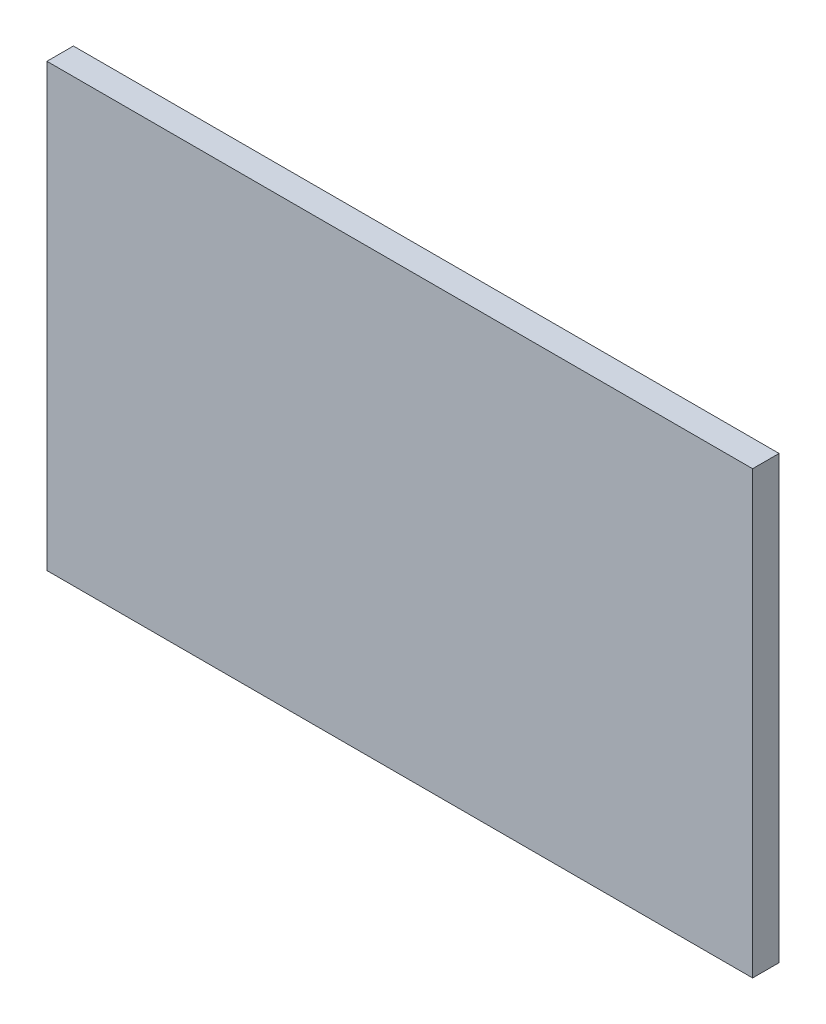
ISO-10303-21;
HEADER;
FILE_DESCRIPTION(('STEP AP214'),'2;1');
FILE_NAME('part.step','',(''),(''),'','','');
FILE_SCHEMA(('AUTOMOTIVE_DESIGN { 1 0 10303 214 1 1 1 1 }'));
ENDSEC;
DATA;
#1=APPLICATION_CONTEXT('core data for automotive mechanical design processes');
#2=APPLICATION_PROTOCOL_DEFINITION('international standard','automotive_design',2000,#1);
#3=PRODUCT_CONTEXT('',#1,'mechanical');
#4=PRODUCT('Part','Part','',(#3));
#5=PRODUCT_RELATED_PRODUCT_CATEGORY('part','',(#4));
#6=PRODUCT_DEFINITION_FORMATION('','',#4);
#7=PRODUCT_DEFINITION_CONTEXT('part definition',#1,'design');
#8=PRODUCT_DEFINITION('design','',#6,#7);
#9=PRODUCT_DEFINITION_SHAPE('','',#8);
#10=(LENGTH_UNIT() NAMED_UNIT(*) SI_UNIT(.MILLI.,.METRE.));
#11=(NAMED_UNIT(*) PLANE_ANGLE_UNIT() SI_UNIT($,.RADIAN.));
#12=(NAMED_UNIT(*) SI_UNIT($,.STERADIAN.) SOLID_ANGLE_UNIT());
#13=UNCERTAINTY_MEASURE_WITH_UNIT(LENGTH_MEASURE(1.E-05),#10,'distance_accuracy_value','');
#14=(GEOMETRIC_REPRESENTATION_CONTEXT(3) GLOBAL_UNCERTAINTY_ASSIGNED_CONTEXT((#13)) GLOBAL_UNIT_ASSIGNED_CONTEXT((#10,
#11,#12)) REPRESENTATION_CONTEXT('',''));
#15=CARTESIAN_POINT('',(0.,0.,0.));
#16=DIRECTION('',(0.,0.,1.));
#17=DIRECTION('',(1.,0.,0.));
#18=AXIS2_PLACEMENT_3D('',#15,#16,#17);
#19=CARTESIAN_POINT('',(-40.,-25.,3.));
#20=DIRECTION('',(1.,0.,0.));
#21=DIRECTION('',(0.,0.,-1.));
#22=AXIS2_PLACEMENT_3D('',#19,#20,#21);
#23=PLANE('',#22);
#24=DIRECTION('',(0.,-1.,0.));
#25=VECTOR('',#24,1.);
#26=CARTESIAN_POINT('',(-40.,-25.,0.));
#27=LINE('',#26,#25);
#28=CARTESIAN_POINT('',(-40.,25.,0.));
#29=VERTEX_POINT('',#28);
#30=CARTESIAN_POINT('',(-40.,-25.,0.));
#31=VERTEX_POINT('',#30);
#32=EDGE_CURVE('E96',#29,#31,#27,.T.);
#33=ORIENTED_EDGE('',*,*,#32,.T.);
#34=DIRECTION('',(0.,0.,-1.));
#35=VECTOR('',#34,1.);
#36=CARTESIAN_POINT('',(-40.,-25.,3.));
#37=LINE('',#36,#35);
#38=CARTESIAN_POINT('',(-40.,-25.,3.));
#39=VERTEX_POINT('',#38);
#40=EDGE_CURVE('E11',#39,#31,#37,.T.);
#41=ORIENTED_EDGE('',*,*,#40,.F.);
#42=DIRECTION('',(0.,-1.,0.));
#43=VECTOR('',#42,1.);
#44=CARTESIAN_POINT('',(-40.,-25.,3.));
#45=LINE('',#44,#43);
#46=CARTESIAN_POINT('',(-40.,25.,3.));
#47=VERTEX_POINT('',#46);
#48=EDGE_CURVE('E84',#47,#39,#45,.T.);
#49=ORIENTED_EDGE('',*,*,#48,.F.);
#50=DIRECTION('',(0.,0.,-1.));
#51=VECTOR('',#50,1.);
#52=CARTESIAN_POINT('',(-40.,25.,3.));
#53=LINE('',#52,#51);
#54=EDGE_CURVE('E92',#47,#29,#53,.T.);
#55=ORIENTED_EDGE('',*,*,#54,.T.);
#56=EDGE_LOOP('',(#33,#41,#49,#55));
#57=FACE_BOUND('',#56,.T.);
#58=ADVANCED_FACE('F33',(#57),#23,.F.);
#59=CARTESIAN_POINT('',(40.,-25.,3.));
#60=DIRECTION('',(0.,1.,0.));
#61=DIRECTION('',(-1.,0.,0.));
#62=AXIS2_PLACEMENT_3D('',#59,#60,#61);
#63=PLANE('',#62);
#64=DIRECTION('',(1.,0.,0.));
#65=VECTOR('',#64,1.);
#66=CARTESIAN_POINT('',(40.,-25.,0.));
#67=LINE('',#66,#65);
#68=CARTESIAN_POINT('',(40.,-25.,0.));
#69=VERTEX_POINT('',#68);
#70=EDGE_CURVE('E88',#31,#69,#67,.T.);
#71=ORIENTED_EDGE('',*,*,#70,.T.);
#72=DIRECTION('',(0.,0.,-1.));
#73=VECTOR('',#72,1.);
#74=CARTESIAN_POINT('',(40.,-25.,3.));
#75=LINE('',#74,#73);
#76=CARTESIAN_POINT('',(40.,-25.,3.));
#77=VERTEX_POINT('',#76);
#78=EDGE_CURVE('E41',#77,#69,#75,.T.);
#79=ORIENTED_EDGE('',*,*,#78,.F.);
#80=DIRECTION('',(1.,0.,0.));
#81=VECTOR('',#80,1.);
#82=CARTESIAN_POINT('',(40.,-25.,3.));
#83=LINE('',#82,#81);
#84=EDGE_CURVE('E79',#39,#77,#83,.T.);
#85=ORIENTED_EDGE('',*,*,#84,.F.);
#86=ORIENTED_EDGE('',*,*,#40,.T.);
#87=EDGE_LOOP('',(#71,#79,#85,#86));
#88=FACE_BOUND('',#87,.T.);
#89=ADVANCED_FACE('F87',(#88),#63,.F.);
#90=CARTESIAN_POINT('',(40.,-25.,3.));
#91=DIRECTION('',(-1.,0.,0.));
#92=DIRECTION('',(0.,0.,1.));
#93=AXIS2_PLACEMENT_3D('',#90,#91,#92);
#94=PLANE('',#93);
#95=DIRECTION('',(0.,1.,0.));
#96=VECTOR('',#95,1.);
#97=CARTESIAN_POINT('',(40.,-25.,0.));
#98=LINE('',#97,#96);
#99=CARTESIAN_POINT('',(40.,25.,0.));
#100=VERTEX_POINT('',#99);
#101=EDGE_CURVE('E66',#69,#100,#98,.T.);
#102=ORIENTED_EDGE('',*,*,#101,.T.);
#103=DIRECTION('',(0.,0.,-1.));
#104=VECTOR('',#103,1.);
#105=CARTESIAN_POINT('',(40.,25.,3.));
#106=LINE('',#105,#104);
#107=CARTESIAN_POINT('',(40.,25.,3.));
#108=VERTEX_POINT('',#107);
#109=EDGE_CURVE('E89',#108,#100,#106,.T.);
#110=ORIENTED_EDGE('',*,*,#109,.F.);
#111=DIRECTION('',(0.,1.,0.));
#112=VECTOR('',#111,1.);
#113=CARTESIAN_POINT('',(40.,-25.,3.));
#114=LINE('',#113,#112);
#115=EDGE_CURVE('E82',#77,#108,#114,.T.);
#116=ORIENTED_EDGE('',*,*,#115,.F.);
#117=ORIENTED_EDGE('',*,*,#78,.T.);
#118=EDGE_LOOP('',(#102,#110,#116,#117));
#119=FACE_BOUND('',#118,.T.);
#120=ADVANCED_FACE('F90',(#119),#94,.F.);
#121=CARTESIAN_POINT('',(40.,25.,3.));
#122=DIRECTION('',(0.,-1.,0.));
#123=DIRECTION('',(1.,0.,0.));
#124=AXIS2_PLACEMENT_3D('',#121,#122,#123);
#125=PLANE('',#124);
#126=DIRECTION('',(-1.,0.,0.));
#127=VECTOR('',#126,1.);
#128=CARTESIAN_POINT('',(40.,25.,0.));
#129=LINE('',#128,#127);
#130=EDGE_CURVE('E72',#100,#29,#129,.T.);
#131=ORIENTED_EDGE('',*,*,#130,.T.);
#132=ORIENTED_EDGE('',*,*,#54,.F.);
#133=DIRECTION('',(-1.,0.,0.));
#134=VECTOR('',#133,1.);
#135=CARTESIAN_POINT('',(40.,25.,3.));
#136=LINE('',#135,#134);
#137=EDGE_CURVE('E49',#108,#47,#136,.T.);
#138=ORIENTED_EDGE('',*,*,#137,.F.);
#139=ORIENTED_EDGE('',*,*,#109,.T.);
#140=EDGE_LOOP('',(#131,#132,#138,#139));
#141=FACE_BOUND('',#140,.T.);
#142=ADVANCED_FACE('F103',(#141),#125,.F.);
#143=CARTESIAN_POINT('',(0.,0.,3.));
#144=DIRECTION('',(0.,0.,1.));
#145=DIRECTION('',(1.,0.,0.));
#146=AXIS2_PLACEMENT_3D('',#143,#144,#145);
#147=PLANE('',#146);
#148=ORIENTED_EDGE('',*,*,#48,.T.);
#149=ORIENTED_EDGE('',*,*,#84,.T.);
#150=ORIENTED_EDGE('',*,*,#115,.T.);
#151=ORIENTED_EDGE('',*,*,#137,.T.);
#152=EDGE_LOOP('',(#148,#149,#150,#151));
#153=FACE_BOUND('',#152,.T.);
#154=ADVANCED_FACE('F80',(#153),#147,.T.);
#155=CARTESIAN_POINT('',(0.,0.,0.));
#156=DIRECTION('',(0.,0.,1.));
#157=DIRECTION('',(1.,0.,0.));
#158=AXIS2_PLACEMENT_3D('',#155,#156,#157);
#159=PLANE('',#158);
#160=ORIENTED_EDGE('',*,*,#32,.F.);
#161=ORIENTED_EDGE('',*,*,#130,.F.);
#162=ORIENTED_EDGE('',*,*,#101,.F.);
#163=ORIENTED_EDGE('',*,*,#70,.F.);
#164=EDGE_LOOP('',(#160,#161,#162,#163));
#165=FACE_BOUND('',#164,.T.);
#166=ADVANCED_FACE('F106',(#165),#159,.F.);
#167=CLOSED_SHELL('',(#58,#89,#120,#142,#154,#166));
#168=MANIFOLD_SOLID_BREP('B2',#167);
#169=ADVANCED_BREP_SHAPE_REPRESENTATION('',(#18,#168),#14);
#170=SHAPE_DEFINITION_REPRESENTATION(#9,#169);
ENDSEC;
END-ISO-10303-21;
